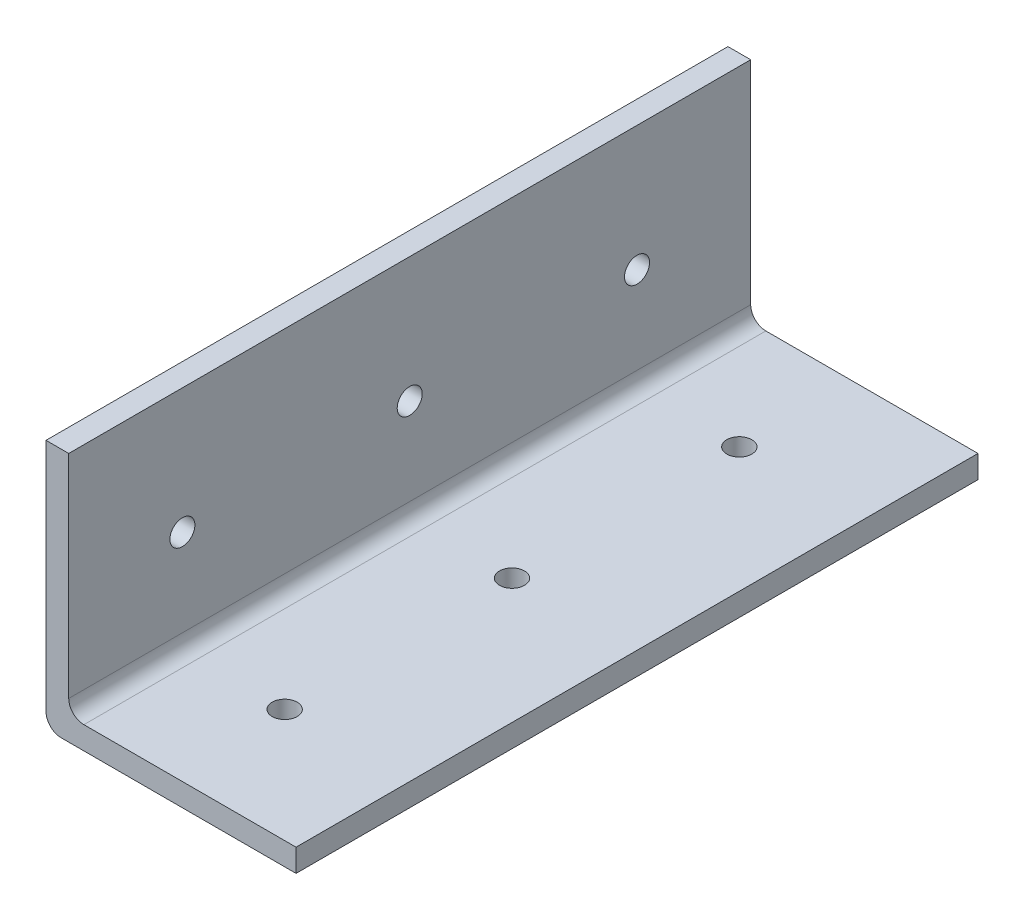
ISO-10303-21;
HEADER;
FILE_DESCRIPTION(('STEP AP214'),'2;1');
FILE_NAME('part.step','',(''),(''),'','','');
FILE_SCHEMA(('AUTOMOTIVE_DESIGN { 1 0 10303 214 1 1 1 1 }'));
ENDSEC;
DATA;
#1=APPLICATION_CONTEXT('core data for automotive mechanical design processes');
#2=APPLICATION_PROTOCOL_DEFINITION('international standard','automotive_design',2000,#1);
#3=PRODUCT_CONTEXT('',#1,'mechanical');
#4=PRODUCT('Part','Part','',(#3));
#5=PRODUCT_RELATED_PRODUCT_CATEGORY('part','',(#4));
#6=PRODUCT_DEFINITION_FORMATION('','',#4);
#7=PRODUCT_DEFINITION_CONTEXT('part definition',#1,'design');
#8=PRODUCT_DEFINITION('design','',#6,#7);
#9=PRODUCT_DEFINITION_SHAPE('','',#8);
#10=(LENGTH_UNIT() NAMED_UNIT(*) SI_UNIT(.MILLI.,.METRE.));
#11=(NAMED_UNIT(*) PLANE_ANGLE_UNIT() SI_UNIT($,.RADIAN.));
#12=(NAMED_UNIT(*) SI_UNIT($,.STERADIAN.) SOLID_ANGLE_UNIT());
#13=UNCERTAINTY_MEASURE_WITH_UNIT(LENGTH_MEASURE(1.E-05),#10,'distance_accuracy_value','');
#14=(GEOMETRIC_REPRESENTATION_CONTEXT(3) GLOBAL_UNCERTAINTY_ASSIGNED_CONTEXT((#13)) GLOBAL_UNIT_ASSIGNED_CONTEXT((#10,
#11,#12)) REPRESENTATION_CONTEXT('',''));
#15=CARTESIAN_POINT('',(0.,0.,0.));
#16=DIRECTION('',(0.,0.,1.));
#17=DIRECTION('',(1.,0.,0.));
#18=AXIS2_PLACEMENT_3D('',#15,#16,#17);
#19=CARTESIAN_POINT('',(-3.,-16.5,15.));
#20=DIRECTION('',(-1.,0.,0.));
#21=DIRECTION('',(0.,0.,1.));
#22=AXIS2_PLACEMENT_3D('',#19,#20,#21);
#23=CYLINDRICAL_SURFACE('',#22,1.65);
#24=CARTESIAN_POINT('',(0.,-16.5,15.));
#25=DIRECTION('',(-1.,0.,0.));
#26=DIRECTION('',(0.,0.,1.));
#27=AXIS2_PLACEMENT_3D('',#24,#25,#26);
#28=CIRCLE('',#27,1.65);
#29=CARTESIAN_POINT('',(0.,-16.5,16.65));
#30=VERTEX_POINT('',#29);
#31=EDGE_CURVE('E168',#30,#30,#28,.F.);
#32=ORIENTED_EDGE('',*,*,#31,.T.);
#33=EDGE_LOOP('',(#32));
#34=FACE_BOUND('',#33,.T.);
#35=CARTESIAN_POINT('',(-3.,-16.5,15.));
#36=DIRECTION('',(-1.,0.,0.));
#37=DIRECTION('',(0.,0.,1.));
#38=AXIS2_PLACEMENT_3D('',#35,#36,#37);
#39=CIRCLE('',#38,1.65);
#40=CARTESIAN_POINT('',(-3.,-16.5,16.65));
#41=VERTEX_POINT('',#40);
#42=EDGE_CURVE('E20',#41,#41,#39,.T.);
#43=ORIENTED_EDGE('',*,*,#42,.T.);
#44=EDGE_LOOP('',(#43));
#45=FACE_BOUND('',#44,.T.);
#46=ADVANCED_FACE('F17',(#34,#45),#23,.F.);
#47=CARTESIAN_POINT('',(-3.,-16.5,45.));
#48=DIRECTION('',(-1.,0.,0.));
#49=DIRECTION('',(0.,0.,1.));
#50=AXIS2_PLACEMENT_3D('',#47,#48,#49);
#51=CYLINDRICAL_SURFACE('',#50,1.65);
#52=CARTESIAN_POINT('',(0.,-16.5,45.));
#53=DIRECTION('',(-1.,0.,0.));
#54=DIRECTION('',(0.,0.,1.));
#55=AXIS2_PLACEMENT_3D('',#52,#53,#54);
#56=CIRCLE('',#55,1.65);
#57=CARTESIAN_POINT('',(0.,-16.5,46.65));
#58=VERTEX_POINT('',#57);
#59=EDGE_CURVE('E202',#58,#58,#56,.F.);
#60=ORIENTED_EDGE('',*,*,#59,.T.);
#61=EDGE_LOOP('',(#60));
#62=FACE_BOUND('',#61,.T.);
#63=CARTESIAN_POINT('',(-3.,-16.5,45.));
#64=DIRECTION('',(-1.,0.,0.));
#65=DIRECTION('',(0.,0.,1.));
#66=AXIS2_PLACEMENT_3D('',#63,#64,#65);
#67=CIRCLE('',#66,1.65);
#68=CARTESIAN_POINT('',(-3.,-16.5,46.65));
#69=VERTEX_POINT('',#68);
#70=EDGE_CURVE('E208',#69,#69,#67,.T.);
#71=ORIENTED_EDGE('',*,*,#70,.T.);
#72=EDGE_LOOP('',(#71));
#73=FACE_BOUND('',#72,.T.);
#74=ADVANCED_FACE('F228',(#62,#73),#51,.F.);
#75=CARTESIAN_POINT('',(-3.,-16.5,75.));
#76=DIRECTION('',(-1.,0.,0.));
#77=DIRECTION('',(0.,0.,1.));
#78=AXIS2_PLACEMENT_3D('',#75,#76,#77);
#79=CYLINDRICAL_SURFACE('',#78,1.65);
#80=CARTESIAN_POINT('',(0.,-16.5,75.));
#81=DIRECTION('',(-1.,0.,0.));
#82=DIRECTION('',(0.,0.,1.));
#83=AXIS2_PLACEMENT_3D('',#80,#81,#82);
#84=CIRCLE('',#83,1.65);
#85=CARTESIAN_POINT('',(0.,-16.5,76.65));
#86=VERTEX_POINT('',#85);
#87=EDGE_CURVE('E102',#86,#86,#84,.F.);
#88=ORIENTED_EDGE('',*,*,#87,.T.);
#89=EDGE_LOOP('',(#88));
#90=FACE_BOUND('',#89,.T.);
#91=CARTESIAN_POINT('',(-3.,-16.5,75.));
#92=DIRECTION('',(-1.,0.,0.));
#93=DIRECTION('',(0.,0.,1.));
#94=AXIS2_PLACEMENT_3D('',#91,#92,#93);
#95=CIRCLE('',#94,1.65);
#96=CARTESIAN_POINT('',(-3.,-16.5,76.65));
#97=VERTEX_POINT('',#96);
#98=EDGE_CURVE('E169',#97,#97,#95,.T.);
#99=ORIENTED_EDGE('',*,*,#98,.T.);
#100=EDGE_LOOP('',(#99));
#101=FACE_BOUND('',#100,.T.);
#102=ADVANCED_FACE('F219',(#90,#101),#79,.F.);
#103=CARTESIAN_POINT('',(-3.,0.,90.));
#104=DIRECTION('',(1.,0.,0.));
#105=DIRECTION('',(0.,0.,-1.));
#106=AXIS2_PLACEMENT_3D('',#103,#104,#105);
#107=PLANE('',#106);
#108=DIRECTION('',(0.,0.,-1.));
#109=VECTOR('',#108,1.);
#110=CARTESIAN_POINT('',(-3.,-31.,90.));
#111=LINE('',#110,#109);
#112=CARTESIAN_POINT('',(-3.,-31.,90.));
#113=VERTEX_POINT('',#112);
#114=CARTESIAN_POINT('',(-3.,-31.,0.));
#115=VERTEX_POINT('',#114);
#116=EDGE_CURVE('E144',#113,#115,#111,.T.);
#117=ORIENTED_EDGE('',*,*,#116,.F.);
#118=DIRECTION('',(0.,1.,0.));
#119=VECTOR('',#118,1.);
#120=CARTESIAN_POINT('',(-3.,0.,90.));
#121=LINE('',#120,#119);
#122=CARTESIAN_POINT('',(-3.,0.,90.));
#123=VERTEX_POINT('',#122);
#124=EDGE_CURVE('E118',#123,#113,#121,.F.);
#125=ORIENTED_EDGE('',*,*,#124,.F.);
#126=DIRECTION('',(0.,0.,-1.));
#127=VECTOR('',#126,1.);
#128=CARTESIAN_POINT('',(-3.,0.,90.));
#129=LINE('',#128,#127);
#130=CARTESIAN_POINT('',(-3.,0.,0.));
#131=VERTEX_POINT('',#130);
#132=EDGE_CURVE('E162',#123,#131,#129,.T.);
#133=ORIENTED_EDGE('',*,*,#132,.T.);
#134=DIRECTION('',(0.,1.,0.));
#135=VECTOR('',#134,1.);
#136=CARTESIAN_POINT('',(-3.,0.,0.));
#137=LINE('',#136,#135);
#138=EDGE_CURVE('E141',#131,#115,#137,.F.);
#139=ORIENTED_EDGE('',*,*,#138,.T.);
#140=EDGE_LOOP('',(#117,#125,#133,#139));
#141=FACE_BOUND('',#140,.T.);
#142=ORIENTED_EDGE('',*,*,#98,.F.);
#143=EDGE_LOOP('',(#142));
#144=FACE_BOUND('',#143,.T.);
#145=ORIENTED_EDGE('',*,*,#70,.F.);
#146=EDGE_LOOP('',(#145));
#147=FACE_BOUND('',#146,.T.);
#148=ORIENTED_EDGE('',*,*,#42,.F.);
#149=EDGE_LOOP('',(#148));
#150=FACE_BOUND('',#149,.T.);
#151=ADVANCED_FACE('F216',(#141,#144,#147,#150),#107,.F.);
#152=CARTESIAN_POINT('',(0.,-30.,90.));
#153=DIRECTION('',(0.,-1.,0.));
#154=DIRECTION('',(0.,0.,-1.));
#155=AXIS2_PLACEMENT_3D('',#152,#153,#154);
#156=PLANE('',#155);
#157=DIRECTION('',(0.,0.,1.));
#158=VECTOR('',#157,1.);
#159=CARTESIAN_POINT('',(2.,-30.,90.));
#160=LINE('',#159,#158);
#161=CARTESIAN_POINT('',(2.,-30.,0.));
#162=VERTEX_POINT('',#161);
#163=CARTESIAN_POINT('',(2.,-30.,90.));
#164=VERTEX_POINT('',#163);
#165=EDGE_CURVE('E54',#162,#164,#160,.T.);
#166=ORIENTED_EDGE('',*,*,#165,.T.);
#167=DIRECTION('',(1.,0.,0.));
#168=VECTOR('',#167,1.);
#169=CARTESIAN_POINT('',(0.,-30.,90.));
#170=LINE('',#169,#168);
#171=CARTESIAN_POINT('',(30.,-30.,90.));
#172=VERTEX_POINT('',#171);
#173=EDGE_CURVE('E93',#172,#164,#170,.F.);
#174=ORIENTED_EDGE('',*,*,#173,.F.);
#175=DIRECTION('',(0.,0.,1.));
#176=VECTOR('',#175,1.);
#177=CARTESIAN_POINT('',(30.,-30.,90.));
#178=LINE('',#177,#176);
#179=CARTESIAN_POINT('',(30.,-30.,0.));
#180=VERTEX_POINT('',#179);
#181=EDGE_CURVE('E64',#172,#180,#178,.F.);
#182=ORIENTED_EDGE('',*,*,#181,.T.);
#183=DIRECTION('',(1.,0.,0.));
#184=VECTOR('',#183,1.);
#185=CARTESIAN_POINT('',(0.,-30.,0.));
#186=LINE('',#185,#184);
#187=EDGE_CURVE('E152',#180,#162,#186,.F.);
#188=ORIENTED_EDGE('',*,*,#187,.T.);
#189=EDGE_LOOP('',(#166,#174,#182,#188));
#190=FACE_BOUND('',#189,.T.);
#191=CARTESIAN_POINT('',(13.5,-30.,15.));
#192=DIRECTION('',(0.,-1.,0.));
#193=DIRECTION('',(0.,0.,-1.));
#194=AXIS2_PLACEMENT_3D('',#191,#192,#193);
#195=CIRCLE('',#194,1.64999999999999);
#196=CARTESIAN_POINT('',(13.5,-30.,13.35));
#197=VERTEX_POINT('',#196);
#198=EDGE_CURVE('E171',#197,#197,#195,.T.);
#199=ORIENTED_EDGE('',*,*,#198,.T.);
#200=EDGE_LOOP('',(#199));
#201=FACE_BOUND('',#200,.T.);
#202=CARTESIAN_POINT('',(13.5,-30.,45.));
#203=DIRECTION('',(0.,-1.,0.));
#204=DIRECTION('',(0.,0.,-1.));
#205=AXIS2_PLACEMENT_3D('',#202,#203,#204);
#206=CIRCLE('',#205,1.64999999999999);
#207=CARTESIAN_POINT('',(13.5,-30.,43.35));
#208=VERTEX_POINT('',#207);
#209=EDGE_CURVE('E195',#208,#208,#206,.T.);
#210=ORIENTED_EDGE('',*,*,#209,.T.);
#211=EDGE_LOOP('',(#210));
#212=FACE_BOUND('',#211,.T.);
#213=CARTESIAN_POINT('',(13.5,-30.,75.));
#214=DIRECTION('',(0.,-1.,0.));
#215=DIRECTION('',(0.,0.,-1.));
#216=AXIS2_PLACEMENT_3D('',#213,#214,#215);
#217=CIRCLE('',#216,1.65);
#218=CARTESIAN_POINT('',(13.5,-30.,73.35));
#219=VERTEX_POINT('',#218);
#220=EDGE_CURVE('E176',#219,#219,#217,.T.);
#221=ORIENTED_EDGE('',*,*,#220,.T.);
#222=EDGE_LOOP('',(#221));
#223=FACE_BOUND('',#222,.T.);
#224=ADVANCED_FACE('F218',(#190,#201,#212,#223),#156,.F.);
#225=CARTESIAN_POINT('',(2.,-28.,90.));
#226=DIRECTION('',(0.,0.,1.));
#227=DIRECTION('',(1.,0.,0.));
#228=AXIS2_PLACEMENT_3D('',#225,#226,#227);
#229=CYLINDRICAL_SURFACE('',#228,2.);
#230=ORIENTED_EDGE('',*,*,#165,.F.);
#231=CARTESIAN_POINT('',(2.,-28.,0.));
#232=DIRECTION('',(0.,0.,1.));
#233=DIRECTION('',(1.,0.,0.));
#234=AXIS2_PLACEMENT_3D('',#231,#232,#233);
#235=CIRCLE('',#234,2.);
#236=CARTESIAN_POINT('',(0.,-28.,0.));
#237=VERTEX_POINT('',#236);
#238=EDGE_CURVE('E97',#162,#237,#235,.F.);
#239=ORIENTED_EDGE('',*,*,#238,.T.);
#240=DIRECTION('',(0.,0.,1.));
#241=VECTOR('',#240,1.);
#242=CARTESIAN_POINT('',(0.,-28.,90.));
#243=LINE('',#242,#241);
#244=CARTESIAN_POINT('',(0.,-28.,90.));
#245=VERTEX_POINT('',#244);
#246=EDGE_CURVE('E95',#237,#245,#243,.T.);
#247=ORIENTED_EDGE('',*,*,#246,.T.);
#248=CARTESIAN_POINT('',(2.,-28.,90.));
#249=DIRECTION('',(0.,0.,1.));
#250=DIRECTION('',(1.,0.,0.));
#251=AXIS2_PLACEMENT_3D('',#248,#249,#250);
#252=CIRCLE('',#251,2.);
#253=EDGE_CURVE('E85',#164,#245,#252,.F.);
#254=ORIENTED_EDGE('',*,*,#253,.F.);
#255=EDGE_LOOP('',(#230,#239,#247,#254));
#256=FACE_BOUND('',#255,.T.);
#257=ADVANCED_FACE('F96',(#256),#229,.F.);
#258=CARTESIAN_POINT('',(0.,0.,90.));
#259=DIRECTION('',(-1.,0.,0.));
#260=DIRECTION('',(0.,-1.,0.));
#261=AXIS2_PLACEMENT_3D('',#258,#259,#260);
#262=PLANE('',#261);
#263=ORIENTED_EDGE('',*,*,#246,.F.);
#264=DIRECTION('',(0.,1.,0.));
#265=VECTOR('',#264,1.);
#266=CARTESIAN_POINT('',(0.,0.,0.));
#267=LINE('',#266,#265);
#268=CARTESIAN_POINT('',(0.,0.,0.));
#269=VERTEX_POINT('',#268);
#270=EDGE_CURVE('E148',#237,#269,#267,.T.);
#271=ORIENTED_EDGE('',*,*,#270,.T.);
#272=DIRECTION('',(0.,0.,-1.));
#273=VECTOR('',#272,1.);
#274=CARTESIAN_POINT('',(0.,0.,90.));
#275=LINE('',#274,#273);
#276=CARTESIAN_POINT('',(0.,0.,90.));
#277=VERTEX_POINT('',#276);
#278=EDGE_CURVE('E101',#269,#277,#275,.F.);
#279=ORIENTED_EDGE('',*,*,#278,.T.);
#280=DIRECTION('',(0.,1.,0.));
#281=VECTOR('',#280,1.);
#282=CARTESIAN_POINT('',(0.,0.,90.));
#283=LINE('',#282,#281);
#284=EDGE_CURVE('E90',#245,#277,#283,.T.);
#285=ORIENTED_EDGE('',*,*,#284,.F.);
#286=EDGE_LOOP('',(#263,#271,#279,#285));
#287=FACE_BOUND('',#286,.T.);
#288=ORIENTED_EDGE('',*,*,#87,.F.);
#289=EDGE_LOOP('',(#288));
#290=FACE_BOUND('',#289,.T.);
#291=ORIENTED_EDGE('',*,*,#59,.F.);
#292=EDGE_LOOP('',(#291));
#293=FACE_BOUND('',#292,.T.);
#294=ORIENTED_EDGE('',*,*,#31,.F.);
#295=EDGE_LOOP('',(#294));
#296=FACE_BOUND('',#295,.T.);
#297=ADVANCED_FACE('F104',(#287,#290,#293,#296),#262,.F.);
#298=CARTESIAN_POINT('',(0.,0.,90.));
#299=DIRECTION('',(0.,-1.,0.));
#300=DIRECTION('',(0.,0.,-1.));
#301=AXIS2_PLACEMENT_3D('',#298,#299,#300);
#302=PLANE('',#301);
#303=ORIENTED_EDGE('',*,*,#132,.F.);
#304=DIRECTION('',(1.,0.,0.));
#305=VECTOR('',#304,1.);
#306=CARTESIAN_POINT('',(0.,0.,90.));
#307=LINE('',#306,#305);
#308=EDGE_CURVE('E107',#277,#123,#307,.F.);
#309=ORIENTED_EDGE('',*,*,#308,.F.);
#310=ORIENTED_EDGE('',*,*,#278,.F.);
#311=DIRECTION('',(1.,0.,0.));
#312=VECTOR('',#311,1.);
#313=CARTESIAN_POINT('',(0.,0.,0.));
#314=LINE('',#313,#312);
#315=EDGE_CURVE('E145',#269,#131,#314,.F.);
#316=ORIENTED_EDGE('',*,*,#315,.T.);
#317=EDGE_LOOP('',(#303,#309,#310,#316));
#318=FACE_BOUND('',#317,.T.);
#319=ADVANCED_FACE('F267',(#318),#302,.F.);
#320=CARTESIAN_POINT('',(13.5,-33.,75.));
#321=DIRECTION('',(0.,-1.,0.));
#322=DIRECTION('',(0.,0.,-1.));
#323=AXIS2_PLACEMENT_3D('',#320,#321,#322);
#324=CYLINDRICAL_SURFACE('',#323,1.65);
#325=ORIENTED_EDGE('',*,*,#220,.F.);
#326=EDGE_LOOP('',(#325));
#327=FACE_BOUND('',#326,.T.);
#328=CARTESIAN_POINT('',(13.5,-33.,75.));
#329=DIRECTION('',(0.,-1.,0.));
#330=DIRECTION('',(0.,0.,-1.));
#331=AXIS2_PLACEMENT_3D('',#328,#329,#330);
#332=CIRCLE('',#331,1.65);
#333=CARTESIAN_POINT('',(13.5,-33.,73.35));
#334=VERTEX_POINT('',#333);
#335=EDGE_CURVE('E109',#334,#334,#332,.T.);
#336=ORIENTED_EDGE('',*,*,#335,.T.);
#337=EDGE_LOOP('',(#336));
#338=FACE_BOUND('',#337,.T.);
#339=ADVANCED_FACE('F263',(#327,#338),#324,.F.);
#340=CARTESIAN_POINT('',(13.5,-33.,45.));
#341=DIRECTION('',(0.,-1.,0.));
#342=DIRECTION('',(0.,0.,-1.));
#343=AXIS2_PLACEMENT_3D('',#340,#341,#342);
#344=CYLINDRICAL_SURFACE('',#343,1.64999999999999);
#345=ORIENTED_EDGE('',*,*,#209,.F.);
#346=EDGE_LOOP('',(#345));
#347=FACE_BOUND('',#346,.T.);
#348=CARTESIAN_POINT('',(13.5,-33.,45.));
#349=DIRECTION('',(0.,-1.,0.));
#350=DIRECTION('',(0.,0.,-1.));
#351=AXIS2_PLACEMENT_3D('',#348,#349,#350);
#352=CIRCLE('',#351,1.64999999999999);
#353=CARTESIAN_POINT('',(13.5,-33.,43.35));
#354=VERTEX_POINT('',#353);
#355=EDGE_CURVE('E185',#354,#354,#352,.T.);
#356=ORIENTED_EDGE('',*,*,#355,.T.);
#357=EDGE_LOOP('',(#356));
#358=FACE_BOUND('',#357,.T.);
#359=ADVANCED_FACE('F259',(#347,#358),#344,.F.);
#360=CARTESIAN_POINT('',(13.5,-33.,15.));
#361=DIRECTION('',(0.,-1.,0.));
#362=DIRECTION('',(0.,0.,-1.));
#363=AXIS2_PLACEMENT_3D('',#360,#361,#362);
#364=CYLINDRICAL_SURFACE('',#363,1.64999999999999);
#365=ORIENTED_EDGE('',*,*,#198,.F.);
#366=EDGE_LOOP('',(#365));
#367=FACE_BOUND('',#366,.T.);
#368=CARTESIAN_POINT('',(13.5,-33.,15.));
#369=DIRECTION('',(0.,-1.,0.));
#370=DIRECTION('',(0.,0.,-1.));
#371=AXIS2_PLACEMENT_3D('',#368,#369,#370);
#372=CIRCLE('',#371,1.64999999999999);
#373=CARTESIAN_POINT('',(13.5,-33.,13.35));
#374=VERTEX_POINT('',#373);
#375=EDGE_CURVE('E134',#374,#374,#372,.T.);
#376=ORIENTED_EDGE('',*,*,#375,.T.);
#377=EDGE_LOOP('',(#376));
#378=FACE_BOUND('',#377,.T.);
#379=ADVANCED_FACE('F255',(#367,#378),#364,.F.);
#380=CARTESIAN_POINT('',(30.,-30.,90.));
#381=DIRECTION('',(-1.,0.,0.));
#382=DIRECTION('',(0.,0.,1.));
#383=AXIS2_PLACEMENT_3D('',#380,#381,#382);
#384=PLANE('',#383);
#385=ORIENTED_EDGE('',*,*,#181,.F.);
#386=DIRECTION('',(0.,1.,0.));
#387=VECTOR('',#386,1.);
#388=CARTESIAN_POINT('',(30.,0.,90.));
#389=LINE('',#388,#387);
#390=CARTESIAN_POINT('',(30.,-33.,90.));
#391=VERTEX_POINT('',#390);
#392=EDGE_CURVE('E115',#391,#172,#389,.T.);
#393=ORIENTED_EDGE('',*,*,#392,.F.);
#394=DIRECTION('',(0.,0.,1.));
#395=VECTOR('',#394,1.);
#396=CARTESIAN_POINT('',(30.,-33.,90.));
#397=LINE('',#396,#395);
#398=CARTESIAN_POINT('',(30.,-33.,0.));
#399=VERTEX_POINT('',#398);
#400=EDGE_CURVE('E131',#391,#399,#397,.F.);
#401=ORIENTED_EDGE('',*,*,#400,.T.);
#402=DIRECTION('',(0.,1.,0.));
#403=VECTOR('',#402,1.);
#404=CARTESIAN_POINT('',(30.,0.,0.));
#405=LINE('',#404,#403);
#406=EDGE_CURVE('E154',#399,#180,#405,.T.);
#407=ORIENTED_EDGE('',*,*,#406,.T.);
#408=EDGE_LOOP('',(#385,#393,#401,#407));
#409=FACE_BOUND('',#408,.T.);
#410=ADVANCED_FACE('F251',(#409),#384,.F.);
#411=CARTESIAN_POINT('',(0.,0.,0.));
#412=DIRECTION('',(0.,0.,1.));
#413=DIRECTION('',(1.,0.,0.));
#414=AXIS2_PLACEMENT_3D('',#411,#412,#413);
#415=PLANE('',#414);
#416=CARTESIAN_POINT('',(-1.,-31.,0.));
#417=DIRECTION('',(0.,0.,-1.));
#418=DIRECTION('',(-1.,0.,0.));
#419=AXIS2_PLACEMENT_3D('',#416,#417,#418);
#420=CIRCLE('',#419,2.);
#421=CARTESIAN_POINT('',(-1.,-33.,0.));
#422=VERTEX_POINT('',#421);
#423=EDGE_CURVE('E120',#115,#422,#420,.F.);
#424=ORIENTED_EDGE('',*,*,#423,.F.);
#425=ORIENTED_EDGE('',*,*,#138,.F.);
#426=ORIENTED_EDGE('',*,*,#315,.F.);
#427=ORIENTED_EDGE('',*,*,#270,.F.);
#428=ORIENTED_EDGE('',*,*,#238,.F.);
#429=ORIENTED_EDGE('',*,*,#187,.F.);
#430=ORIENTED_EDGE('',*,*,#406,.F.);
#431=DIRECTION('',(1.,0.,0.));
#432=VECTOR('',#431,1.);
#433=CARTESIAN_POINT('',(-3.,-33.,0.));
#434=LINE('',#433,#432);
#435=EDGE_CURVE('E124',#399,#422,#434,.F.);
#436=ORIENTED_EDGE('',*,*,#435,.T.);
#437=EDGE_LOOP('',(#424,#425,#426,#427,#428,#429,#430,#436));
#438=FACE_BOUND('',#437,.T.);
#439=ADVANCED_FACE('F247',(#438),#415,.F.);
#440=CARTESIAN_POINT('',(-1.,-31.,90.));
#441=DIRECTION('',(0.,0.,-1.));
#442=DIRECTION('',(-1.,0.,0.));
#443=AXIS2_PLACEMENT_3D('',#440,#441,#442);
#444=CYLINDRICAL_SURFACE('',#443,2.);
#445=ORIENTED_EDGE('',*,*,#423,.T.);
#446=DIRECTION('',(0.,0.,1.));
#447=VECTOR('',#446,1.);
#448=CARTESIAN_POINT('',(-1.,-33.,90.));
#449=LINE('',#448,#447);
#450=CARTESIAN_POINT('',(-1.,-33.,90.));
#451=VERTEX_POINT('',#450);
#452=EDGE_CURVE('E26',#422,#451,#449,.T.);
#453=ORIENTED_EDGE('',*,*,#452,.T.);
#454=CARTESIAN_POINT('',(-1.,-31.,90.));
#455=DIRECTION('',(0.,0.,-1.));
#456=DIRECTION('',(-1.,0.,0.));
#457=AXIS2_PLACEMENT_3D('',#454,#455,#456);
#458=CIRCLE('',#457,2.);
#459=EDGE_CURVE('E34',#113,#451,#458,.F.);
#460=ORIENTED_EDGE('',*,*,#459,.F.);
#461=ORIENTED_EDGE('',*,*,#116,.T.);
#462=EDGE_LOOP('',(#445,#453,#460,#461));
#463=FACE_BOUND('',#462,.T.);
#464=ADVANCED_FACE('F240',(#463),#444,.T.);
#465=CARTESIAN_POINT('',(0.,0.,90.));
#466=DIRECTION('',(0.,0.,1.));
#467=DIRECTION('',(1.,0.,0.));
#468=AXIS2_PLACEMENT_3D('',#465,#466,#467);
#469=PLANE('',#468);
#470=ORIENTED_EDGE('',*,*,#284,.T.);
#471=ORIENTED_EDGE('',*,*,#308,.T.);
#472=ORIENTED_EDGE('',*,*,#124,.T.);
#473=ORIENTED_EDGE('',*,*,#459,.T.);
#474=DIRECTION('',(1.,0.,0.));
#475=VECTOR('',#474,1.);
#476=CARTESIAN_POINT('',(-3.,-33.,90.));
#477=LINE('',#476,#475);
#478=EDGE_CURVE('E11',#451,#391,#477,.T.);
#479=ORIENTED_EDGE('',*,*,#478,.T.);
#480=ORIENTED_EDGE('',*,*,#392,.T.);
#481=ORIENTED_EDGE('',*,*,#173,.T.);
#482=ORIENTED_EDGE('',*,*,#253,.T.);
#483=EDGE_LOOP('',(#470,#471,#472,#473,#479,#480,#481,#482));
#484=FACE_BOUND('',#483,.T.);
#485=ADVANCED_FACE('F87',(#484),#469,.T.);
#486=CARTESIAN_POINT('',(-3.,-33.,90.));
#487=DIRECTION('',(0.,1.,0.));
#488=DIRECTION('',(0.,0.,1.));
#489=AXIS2_PLACEMENT_3D('',#486,#487,#488);
#490=PLANE('',#489);
#491=ORIENTED_EDGE('',*,*,#452,.F.);
#492=ORIENTED_EDGE('',*,*,#435,.F.);
#493=ORIENTED_EDGE('',*,*,#400,.F.);
#494=ORIENTED_EDGE('',*,*,#478,.F.);
#495=EDGE_LOOP('',(#491,#492,#493,#494));
#496=FACE_BOUND('',#495,.T.);
#497=ORIENTED_EDGE('',*,*,#375,.F.);
#498=EDGE_LOOP('',(#497));
#499=FACE_BOUND('',#498,.T.);
#500=ORIENTED_EDGE('',*,*,#355,.F.);
#501=EDGE_LOOP('',(#500));
#502=FACE_BOUND('',#501,.T.);
#503=ORIENTED_EDGE('',*,*,#335,.F.);
#504=EDGE_LOOP('',(#503));
#505=FACE_BOUND('',#504,.T.);
#506=ADVANCED_FACE('F233',(#496,#499,#502,#505),#490,.F.);
#507=CLOSED_SHELL('',(#46,#74,#102,#151,#224,#257,#297,#319,#339,#359,#379,#410,#439,#464,#485,#506));
#508=MANIFOLD_SOLID_BREP('B1',#507);
#509=ADVANCED_BREP_SHAPE_REPRESENTATION('',(#18,#508),#14);
#510=SHAPE_DEFINITION_REPRESENTATION(#9,#509);
ENDSEC;
END-ISO-10303-21;
